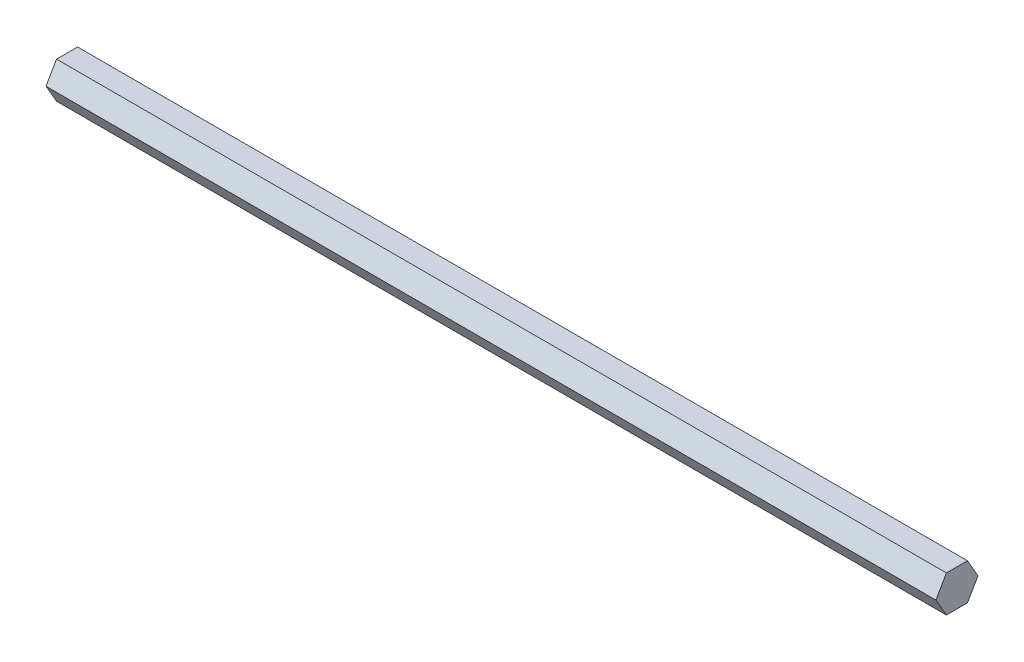
ISO-10303-21;
HEADER;
FILE_DESCRIPTION(('STEP AP214'),'2;1');
FILE_NAME('part.step','',(''),(''),'','','');
FILE_SCHEMA(('AUTOMOTIVE_DESIGN { 1 0 10303 214 1 1 1 1 }'));
ENDSEC;
DATA;
#1=APPLICATION_CONTEXT('core data for automotive mechanical design processes');
#2=APPLICATION_PROTOCOL_DEFINITION('international standard','automotive_design',2000,#1);
#3=PRODUCT_CONTEXT('',#1,'mechanical');
#4=PRODUCT('Part','Part','',(#3));
#5=PRODUCT_RELATED_PRODUCT_CATEGORY('part','',(#4));
#6=PRODUCT_DEFINITION_FORMATION('','',#4);
#7=PRODUCT_DEFINITION_CONTEXT('part definition',#1,'design');
#8=PRODUCT_DEFINITION('design','',#6,#7);
#9=PRODUCT_DEFINITION_SHAPE('','',#8);
#10=(LENGTH_UNIT() NAMED_UNIT(*) SI_UNIT(.MILLI.,.METRE.));
#11=(NAMED_UNIT(*) PLANE_ANGLE_UNIT() SI_UNIT($,.RADIAN.));
#12=(NAMED_UNIT(*) SI_UNIT($,.STERADIAN.) SOLID_ANGLE_UNIT());
#13=UNCERTAINTY_MEASURE_WITH_UNIT(LENGTH_MEASURE(1.E-05),#10,'distance_accuracy_value','');
#14=(GEOMETRIC_REPRESENTATION_CONTEXT(3) GLOBAL_UNCERTAINTY_ASSIGNED_CONTEXT((#13)) GLOBAL_UNIT_ASSIGNED_CONTEXT((#10,
#11,#12)) REPRESENTATION_CONTEXT('',''));
#15=CARTESIAN_POINT('',(0.,0.,0.));
#16=DIRECTION('',(0.,0.,1.));
#17=DIRECTION('',(1.,0.,0.));
#18=AXIS2_PLACEMENT_3D('',#15,#16,#17);
#19=CARTESIAN_POINT('',(310.,-6.34999999999995,-3.66617420935419));
#20=DIRECTION('',(0.,0.499999999999995,0.866025403784442));
#21=DIRECTION('',(0.,-0.866025403784442,0.499999999999995));
#22=AXIS2_PLACEMENT_3D('',#19,#20,#21);
#23=PLANE('',#22);
#24=DIRECTION('',(0.,0.866025403784442,-0.499999999999995));
#25=VECTOR('',#24,1.);
#26=CARTESIAN_POINT('',(0.,-6.34999999999995,-3.66617420935419));
#27=LINE('',#26,#25);
#28=CARTESIAN_POINT('',(0.,-6.34999999999995,-3.66617420935419));
#29=VERTEX_POINT('',#28);
#30=CARTESIAN_POINT('',(0.,0.,-7.33234841870824));
#31=VERTEX_POINT('',#30);
#32=EDGE_CURVE('E128',#29,#31,#27,.T.);
#33=ORIENTED_EDGE('',*,*,#32,.T.);
#34=DIRECTION('',(-1.,0.,0.));
#35=VECTOR('',#34,1.);
#36=CARTESIAN_POINT('',(310.,0.,-7.33234841870824));
#37=LINE('',#36,#35);
#38=CARTESIAN_POINT('',(310.,0.,-7.33234841870824));
#39=VERTEX_POINT('',#38);
#40=EDGE_CURVE('E11',#39,#31,#37,.T.);
#41=ORIENTED_EDGE('',*,*,#40,.F.);
#42=DIRECTION('',(0.,0.866025403784442,-0.499999999999995));
#43=VECTOR('',#42,1.);
#44=CARTESIAN_POINT('',(310.,-6.34999999999995,-3.66617420935419));
#45=LINE('',#44,#43);
#46=CARTESIAN_POINT('',(310.,-6.34999999999995,-3.66617420935419));
#47=VERTEX_POINT('',#46);
#48=EDGE_CURVE('E144',#47,#39,#45,.T.);
#49=ORIENTED_EDGE('',*,*,#48,.F.);
#50=DIRECTION('',(-1.,0.,0.));
#51=VECTOR('',#50,1.);
#52=CARTESIAN_POINT('',(310.,-6.34999999999995,-3.66617420935419));
#53=LINE('',#52,#51);
#54=EDGE_CURVE('E124',#47,#29,#53,.T.);
#55=ORIENTED_EDGE('',*,*,#54,.T.);
#56=EDGE_LOOP('',(#33,#41,#49,#55));
#57=FACE_BOUND('',#56,.T.);
#58=ADVANCED_FACE('F39',(#57),#23,.F.);
#59=CARTESIAN_POINT('',(310.,0.,-7.33234841870824));
#60=DIRECTION('',(0.,-0.500000000000001,0.866025403784438));
#61=DIRECTION('',(0.,-0.866025403784438,-0.500000000000001));
#62=AXIS2_PLACEMENT_3D('',#59,#60,#61);
#63=PLANE('',#62);
#64=DIRECTION('',(0.,0.866025403784438,0.500000000000001));
#65=VECTOR('',#64,1.);
#66=CARTESIAN_POINT('',(0.,0.,-7.33234841870824));
#67=LINE('',#66,#65);
#68=CARTESIAN_POINT('',(0.,6.35,-3.6661742093541));
#69=VERTEX_POINT('',#68);
#70=EDGE_CURVE('E132',#31,#69,#67,.T.);
#71=ORIENTED_EDGE('',*,*,#70,.T.);
#72=DIRECTION('',(-1.,0.,0.));
#73=VECTOR('',#72,1.);
#74=CARTESIAN_POINT('',(310.,6.35,-3.6661742093541));
#75=LINE('',#74,#73);
#76=CARTESIAN_POINT('',(310.,6.35,-3.6661742093541));
#77=VERTEX_POINT('',#76);
#78=EDGE_CURVE('E48',#77,#69,#75,.T.);
#79=ORIENTED_EDGE('',*,*,#78,.F.);
#80=DIRECTION('',(0.,0.866025403784438,0.500000000000001));
#81=VECTOR('',#80,1.);
#82=CARTESIAN_POINT('',(310.,0.,-7.33234841870824));
#83=LINE('',#82,#81);
#84=EDGE_CURVE('E93',#39,#77,#83,.T.);
#85=ORIENTED_EDGE('',*,*,#84,.F.);
#86=ORIENTED_EDGE('',*,*,#40,.T.);
#87=EDGE_LOOP('',(#71,#79,#85,#86));
#88=FACE_BOUND('',#87,.T.);
#89=ADVANCED_FACE('F172',(#88),#63,.F.);
#90=CARTESIAN_POINT('',(310.,6.35,-3.6661742093541));
#91=DIRECTION('',(0.,-1.,0.));
#92=DIRECTION('',(0.,0.,-1.));
#93=AXIS2_PLACEMENT_3D('',#90,#91,#92);
#94=PLANE('',#93);
#95=DIRECTION('',(0.,0.,1.));
#96=VECTOR('',#95,1.);
#97=CARTESIAN_POINT('',(0.,6.35,-3.6661742093541));
#98=LINE('',#97,#96);
#99=CARTESIAN_POINT('',(0.,6.34999999999998,3.66617420935415));
#100=VERTEX_POINT('',#99);
#101=EDGE_CURVE('E135',#69,#100,#98,.T.);
#102=ORIENTED_EDGE('',*,*,#101,.T.);
#103=DIRECTION('',(-1.,0.,0.));
#104=VECTOR('',#103,1.);
#105=CARTESIAN_POINT('',(310.,6.34999999999998,3.66617420935415));
#106=LINE('',#105,#104);
#107=CARTESIAN_POINT('',(310.,6.34999999999998,3.66617420935415));
#108=VERTEX_POINT('',#107);
#109=EDGE_CURVE('E117',#108,#100,#106,.T.);
#110=ORIENTED_EDGE('',*,*,#109,.F.);
#111=DIRECTION('',(0.,0.,1.));
#112=VECTOR('',#111,1.);
#113=CARTESIAN_POINT('',(310.,6.35,-3.6661742093541));
#114=LINE('',#113,#112);
#115=EDGE_CURVE('E106',#77,#108,#114,.T.);
#116=ORIENTED_EDGE('',*,*,#115,.F.);
#117=ORIENTED_EDGE('',*,*,#78,.T.);
#118=EDGE_LOOP('',(#102,#110,#116,#117));
#119=FACE_BOUND('',#118,.T.);
#120=ADVANCED_FACE('F154',(#119),#94,.F.);
#121=CARTESIAN_POINT('',(310.,6.34999999999998,3.66617420935415));
#122=DIRECTION('',(0.,-0.499999999999995,-0.866025403784442));
#123=DIRECTION('',(0.,0.866025403784442,-0.499999999999995));
#124=AXIS2_PLACEMENT_3D('',#121,#122,#123);
#125=PLANE('',#124);
#126=DIRECTION('',(0.,-0.866025403784442,0.499999999999995));
#127=VECTOR('',#126,1.);
#128=CARTESIAN_POINT('',(0.,6.34999999999998,3.66617420935415));
#129=LINE('',#128,#127);
#130=CARTESIAN_POINT('',(0.,0.,7.33234841870824));
#131=VERTEX_POINT('',#130);
#132=EDGE_CURVE('E115',#100,#131,#129,.T.);
#133=ORIENTED_EDGE('',*,*,#132,.T.);
#134=DIRECTION('',(-1.,0.,0.));
#135=VECTOR('',#134,1.);
#136=CARTESIAN_POINT('',(310.,0.,7.33234841870824));
#137=LINE('',#136,#135);
#138=CARTESIAN_POINT('',(310.,0.,7.33234841870824));
#139=VERTEX_POINT('',#138);
#140=EDGE_CURVE('E112',#139,#131,#137,.T.);
#141=ORIENTED_EDGE('',*,*,#140,.F.);
#142=DIRECTION('',(0.,-0.866025403784442,0.499999999999995));
#143=VECTOR('',#142,1.);
#144=CARTESIAN_POINT('',(310.,6.34999999999998,3.66617420935415));
#145=LINE('',#144,#143);
#146=EDGE_CURVE('E100',#108,#139,#145,.T.);
#147=ORIENTED_EDGE('',*,*,#146,.F.);
#148=ORIENTED_EDGE('',*,*,#109,.T.);
#149=EDGE_LOOP('',(#133,#141,#147,#148));
#150=FACE_BOUND('',#149,.T.);
#151=ADVANCED_FACE('F113',(#150),#125,.F.);
#152=CARTESIAN_POINT('',(310.,0.,7.33234841870824));
#153=DIRECTION('',(0.,0.500000000000007,-0.866025403784435));
#154=DIRECTION('',(0.,0.866025403784435,0.500000000000007));
#155=AXIS2_PLACEMENT_3D('',#152,#153,#154);
#156=PLANE('',#155);
#157=DIRECTION('',(0.,-0.866025403784435,-0.500000000000007));
#158=VECTOR('',#157,1.);
#159=CARTESIAN_POINT('',(0.,0.,7.33234841870824));
#160=LINE('',#159,#158);
#161=CARTESIAN_POINT('',(0.,-6.35000000000003,3.66617420935406));
#162=VERTEX_POINT('',#161);
#163=EDGE_CURVE('E79',#131,#162,#160,.T.);
#164=ORIENTED_EDGE('',*,*,#163,.T.);
#165=DIRECTION('',(-1.,0.,0.));
#166=VECTOR('',#165,1.);
#167=CARTESIAN_POINT('',(310.,-6.35000000000003,3.66617420935406));
#168=LINE('',#167,#166);
#169=CARTESIAN_POINT('',(310.,-6.35000000000003,3.66617420935406));
#170=VERTEX_POINT('',#169);
#171=EDGE_CURVE('E118',#170,#162,#168,.T.);
#172=ORIENTED_EDGE('',*,*,#171,.F.);
#173=DIRECTION('',(0.,-0.866025403784435,-0.500000000000007));
#174=VECTOR('',#173,1.);
#175=CARTESIAN_POINT('',(310.,0.,7.33234841870824));
#176=LINE('',#175,#174);
#177=EDGE_CURVE('E104',#139,#170,#176,.T.);
#178=ORIENTED_EDGE('',*,*,#177,.F.);
#179=ORIENTED_EDGE('',*,*,#140,.T.);
#180=EDGE_LOOP('',(#164,#172,#178,#179));
#181=FACE_BOUND('',#180,.T.);
#182=ADVANCED_FACE('F120',(#181),#156,.F.);
#183=CARTESIAN_POINT('',(310.,-6.35000000000003,3.66617420935406));
#184=DIRECTION('',(0.,1.,0.));
#185=DIRECTION('',(0.,0.,1.));
#186=AXIS2_PLACEMENT_3D('',#183,#184,#185);
#187=PLANE('',#186);
#188=DIRECTION('',(0.,0.,-1.));
#189=VECTOR('',#188,1.);
#190=CARTESIAN_POINT('',(0.,-6.35000000000003,3.66617420935406));
#191=LINE('',#190,#189);
#192=EDGE_CURVE('E85',#162,#29,#191,.T.);
#193=ORIENTED_EDGE('',*,*,#192,.T.);
#194=ORIENTED_EDGE('',*,*,#54,.F.);
#195=DIRECTION('',(0.,0.,-1.));
#196=VECTOR('',#195,1.);
#197=CARTESIAN_POINT('',(310.,-6.35000000000003,3.66617420935406));
#198=LINE('',#197,#196);
#199=EDGE_CURVE('E56',#170,#47,#198,.T.);
#200=ORIENTED_EDGE('',*,*,#199,.F.);
#201=ORIENTED_EDGE('',*,*,#171,.T.);
#202=EDGE_LOOP('',(#193,#194,#200,#201));
#203=FACE_BOUND('',#202,.T.);
#204=ADVANCED_FACE('F161',(#203),#187,.F.);
#205=CARTESIAN_POINT('',(310.,0.,0.));
#206=DIRECTION('',(1.,0.,0.));
#207=DIRECTION('',(0.,0.,-1.));
#208=AXIS2_PLACEMENT_3D('',#205,#206,#207);
#209=PLANE('',#208);
#210=ORIENTED_EDGE('',*,*,#48,.T.);
#211=ORIENTED_EDGE('',*,*,#84,.T.);
#212=ORIENTED_EDGE('',*,*,#115,.T.);
#213=ORIENTED_EDGE('',*,*,#146,.T.);
#214=ORIENTED_EDGE('',*,*,#177,.T.);
#215=ORIENTED_EDGE('',*,*,#199,.T.);
#216=EDGE_LOOP('',(#210,#211,#212,#213,#214,#215));
#217=FACE_BOUND('',#216,.T.);
#218=ADVANCED_FACE('F102',(#217),#209,.T.);
#219=CARTESIAN_POINT('',(0.,0.,0.));
#220=DIRECTION('',(1.,0.,0.));
#221=DIRECTION('',(0.,0.,-1.));
#222=AXIS2_PLACEMENT_3D('',#219,#220,#221);
#223=PLANE('',#222);
#224=ORIENTED_EDGE('',*,*,#32,.F.);
#225=ORIENTED_EDGE('',*,*,#192,.F.);
#226=ORIENTED_EDGE('',*,*,#163,.F.);
#227=ORIENTED_EDGE('',*,*,#132,.F.);
#228=ORIENTED_EDGE('',*,*,#101,.F.);
#229=ORIENTED_EDGE('',*,*,#70,.F.);
#230=EDGE_LOOP('',(#224,#225,#226,#227,#228,#229));
#231=FACE_BOUND('',#230,.T.);
#232=ADVANCED_FACE('F157',(#231),#223,.F.);
#233=CLOSED_SHELL('',(#58,#89,#120,#151,#182,#204,#218,#232));
#234=MANIFOLD_SOLID_BREP('B2',#233);
#235=ADVANCED_BREP_SHAPE_REPRESENTATION('',(#18,#234),#14);
#236=SHAPE_DEFINITION_REPRESENTATION(#9,#235);
ENDSEC;
END-ISO-10303-21;
